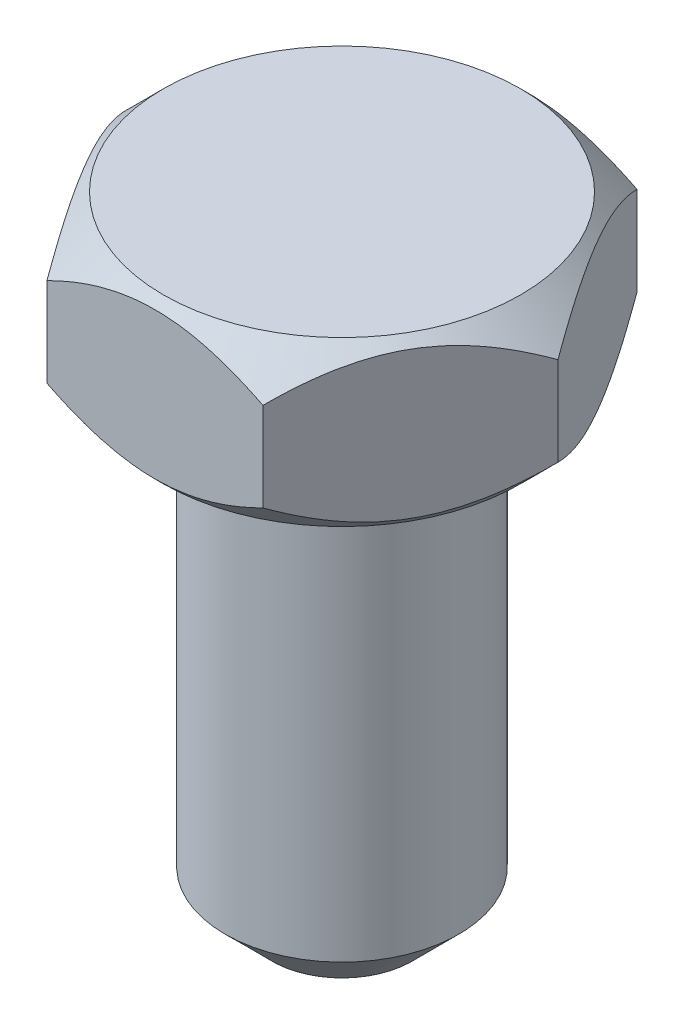
ISO-10303-21;
HEADER;
FILE_DESCRIPTION(('STEP AP214'),'2;1');
FILE_NAME('part.step','',(''),(''),'','','');
FILE_SCHEMA(('AUTOMOTIVE_DESIGN { 1 0 10303 214 1 1 1 1 }'));
ENDSEC;
DATA;
#1=APPLICATION_CONTEXT('core data for automotive mechanical design processes');
#2=APPLICATION_PROTOCOL_DEFINITION('international standard','automotive_design',2000,#1);
#3=PRODUCT_CONTEXT('',#1,'mechanical');
#4=PRODUCT('Part','Part','',(#3));
#5=PRODUCT_RELATED_PRODUCT_CATEGORY('part','',(#4));
#6=PRODUCT_DEFINITION_FORMATION('','',#4);
#7=PRODUCT_DEFINITION_CONTEXT('part definition',#1,'design');
#8=PRODUCT_DEFINITION('design','',#6,#7);
#9=PRODUCT_DEFINITION_SHAPE('','',#8);
#10=(LENGTH_UNIT() NAMED_UNIT(*) SI_UNIT(.MILLI.,.METRE.));
#11=(NAMED_UNIT(*) PLANE_ANGLE_UNIT() SI_UNIT($,.RADIAN.));
#12=(NAMED_UNIT(*) SI_UNIT($,.STERADIAN.) SOLID_ANGLE_UNIT());
#13=UNCERTAINTY_MEASURE_WITH_UNIT(LENGTH_MEASURE(1.E-05),#10,'distance_accuracy_value','');
#14=(GEOMETRIC_REPRESENTATION_CONTEXT(3) GLOBAL_UNCERTAINTY_ASSIGNED_CONTEXT((#13)) GLOBAL_UNIT_ASSIGNED_CONTEXT((#10,
#11,#12)) REPRESENTATION_CONTEXT('',''));
#15=CARTESIAN_POINT('',(0.,0.,0.));
#16=DIRECTION('',(0.,0.,1.));
#17=DIRECTION('',(1.,0.,0.));
#18=AXIS2_PLACEMENT_3D('',#15,#16,#17);
#19=CARTESIAN_POINT('',(-4.61880215351701,-3.5,0.));
#20=DIRECTION('',(0.,1.,0.));
#21=DIRECTION('',(0.,0.,1.));
#22=AXIS2_PLACEMENT_3D('',#19,#20,#21);
#23=PLANE('',#22);
#24=CARTESIAN_POINT('',(0.,-3.5,0.));
#25=DIRECTION('',(0.,1.,0.));
#26=DIRECTION('',(0.,0.,1.));
#27=AXIS2_PLACEMENT_3D('',#24,#25,#26);
#28=CIRCLE('',#27,3.81880215351701);
#29=CARTESIAN_POINT('',(0.,-3.5,3.81880215351701));
#30=VERTEX_POINT('',#29);
#31=EDGE_CURVE('E101',#30,#30,#28,.T.);
#32=ORIENTED_EDGE('',*,*,#31,.F.);
#33=EDGE_LOOP('',(#32));
#34=FACE_BOUND('',#33,.T.);
#35=CARTESIAN_POINT('',(0.,-3.5,0.));
#36=DIRECTION('',(0.,1.,0.));
#37=DIRECTION('',(0.,0.,1.));
#38=AXIS2_PLACEMENT_3D('',#35,#36,#37);
#39=CIRCLE('',#38,2.5);
#40=CARTESIAN_POINT('',(0.,-3.5,2.5));
#41=VERTEX_POINT('',#40);
#42=EDGE_CURVE('E116',#41,#41,#39,.F.);
#43=ORIENTED_EDGE('',*,*,#42,.F.);
#44=EDGE_LOOP('',(#43));
#45=FACE_BOUND('',#44,.T.);
#46=ADVANCED_FACE('F28',(#34,#45),#23,.F.);
#47=CARTESIAN_POINT('',(0.,-13.5,0.));
#48=DIRECTION('',(0.,1.,0.));
#49=DIRECTION('',(0.,0.,1.));
#50=AXIS2_PLACEMENT_3D('',#47,#48,#49);
#51=CYLINDRICAL_SURFACE('',#50,2.5);
#52=CARTESIAN_POINT('',(0.,-12.5,0.));
#53=DIRECTION('',(0.,-1.,0.));
#54=DIRECTION('',(0.,0.,-1.));
#55=AXIS2_PLACEMENT_3D('',#52,#53,#54);
#56=CIRCLE('',#55,2.5);
#57=CARTESIAN_POINT('',(0.,-12.5,-2.5));
#58=VERTEX_POINT('',#57);
#59=EDGE_CURVE('E41',#58,#58,#56,.F.);
#60=ORIENTED_EDGE('',*,*,#59,.T.);
#61=EDGE_LOOP('',(#60));
#62=FACE_BOUND('',#61,.T.);
#63=ORIENTED_EDGE('',*,*,#42,.T.);
#64=EDGE_LOOP('',(#63));
#65=FACE_BOUND('',#64,.T.);
#66=ADVANCED_FACE('F125',(#62,#65),#51,.T.);
#67=CARTESIAN_POINT('',(0.,-13.5,0.));
#68=DIRECTION('',(0.,-1.,0.));
#69=DIRECTION('',(0.,0.,-1.));
#70=AXIS2_PLACEMENT_3D('',#67,#68,#69);
#71=PLANE('',#70);
#72=CARTESIAN_POINT('',(0.,-13.5,0.));
#73=DIRECTION('',(0.,-1.,0.));
#74=DIRECTION('',(0.,0.,-1.));
#75=AXIS2_PLACEMENT_3D('',#72,#73,#74);
#76=CIRCLE('',#75,1.5);
#77=CARTESIAN_POINT('',(0.,-13.5,-1.5));
#78=VERTEX_POINT('',#77);
#79=EDGE_CURVE('E119',#78,#78,#76,.T.);
#80=ORIENTED_EDGE('',*,*,#79,.T.);
#81=EDGE_LOOP('',(#80));
#82=FACE_BOUND('',#81,.T.);
#83=ADVANCED_FACE('F131',(#82),#71,.T.);
#84=CARTESIAN_POINT('',(0.,-13.5,0.));
#85=DIRECTION('',(0.,1.,0.));
#86=DIRECTION('',(0.,0.,1.));
#87=AXIS2_PLACEMENT_3D('',#84,#85,#86);
#88=CONICAL_SURFACE('',#87,1.5,0.785398163397446);
#89=ORIENTED_EDGE('',*,*,#59,.F.);
#90=EDGE_LOOP('',(#89));
#91=FACE_BOUND('',#90,.T.);
#92=ORIENTED_EDGE('',*,*,#79,.F.);
#93=EDGE_LOOP('',(#92));
#94=FACE_BOUND('',#93,.T.);
#95=ADVANCED_FACE('F128',(#91,#94),#88,.T.);
#96=CARTESIAN_POINT('',(0.,-3.5,0.));
#97=DIRECTION('',(0.,1.,0.));
#98=DIRECTION('',(0.,0.,1.));
#99=AXIS2_PLACEMENT_3D('',#96,#97,#98);
#100=CONICAL_SURFACE('',#99,3.81880215351701,0.785398163397448);
#101=CARTESIAN_POINT('',(-4.61891762357085,-2.69988452561614,0.000200000000027756));
#102=CARTESIAN_POINT('',(-4.57920690352857,-2.73959114404244,-0.068580984718356));
#103=CARTESIAN_POINT('',(-4.53919230356692,-2.77807958288685,-0.137888304896475));
#104=CARTESIAN_POINT('',(-4.45849274714728,-2.8522487762645,-0.277664036763568));
#105=CARTESIAN_POINT('',(-4.41780743901014,-2.88792799726836,-0.348133057578679));
#106=CARTESIAN_POINT('',(-4.29427352009149,-2.99049913234901,-0.562100081603879));
#107=CARTESIAN_POINT('',(-4.21037499527408,-3.05248688898744,-0.707416589267722));
#108=CARTESIAN_POINT('',(-4.04121970302445,-3.1586441309906,-1.00040214981323));
#109=CARTESIAN_POINT('',(-3.95600566300933,-3.20308094454657,-1.14799719663762));
#110=CARTESIAN_POINT('',(-3.78369592639709,-3.27155101787056,-1.44644641508885));
#111=CARTESIAN_POINT('',(-3.6966055069617,-3.29563536213871,-1.59729144640342));
#112=CARTESIAN_POINT('',(-3.54650860589272,-3.31736511913948,-1.85726690511355));
#113=CARTESIAN_POINT('',(-3.48369550790706,-3.32058108535916,-1.96606238220551));
#114=CARTESIAN_POINT('',(-3.35817126167379,-3.31515994177501,-2.18347675426331));
#115=CARTESIAN_POINT('',(-3.29546015687919,-3.30651867682818,-2.29209557396634));
#116=CARTESIAN_POINT('',(-3.17063214810082,-3.27787596150358,-2.50830402737814));
#117=CARTESIAN_POINT('',(-3.10851598784037,-3.25786180544875,-2.61589237292032));
#118=CARTESIAN_POINT('',(-2.98535047827865,-3.20756584263536,-2.82922129322133));
#119=CARTESIAN_POINT('',(-2.92430104755975,-3.17728482312165,-2.93496200899963));
#120=CARTESIAN_POINT('',(-2.81592361944285,-3.11498474730579,-3.12267722089175));
#121=CARTESIAN_POINT('',(-2.76835567444983,-3.08460372013991,-3.2050673184313));
#122=CARTESIAN_POINT('',(-2.67407371522763,-3.01894553543967,-3.36836846204128));
#123=CARTESIAN_POINT('',(-2.6273597270248,-2.98366822896023,-3.44927946303275));
#124=CARTESIAN_POINT('',(-2.53493285809128,-2.90900831297909,-3.60936749601013));
#125=CARTESIAN_POINT('',(-2.48921734857499,-2.86963861299641,-3.68854908118623));
#126=CARTESIAN_POINT('',(-2.39863292742736,-2.78731089185671,-3.84544590098815));
#127=CARTESIAN_POINT('',(-2.35376351682289,-2.74435507219806,-3.92316199986076));
#128=CARTESIAN_POINT('',(-2.30928560670467,-2.69988452561615,-4.0002));
#129=B_SPLINE_CURVE_WITH_KNOTS('',3,(#101,#102,#103,#104,#105,#106,#107,#108,#109,#110,#111,
#112,#113,#114,#115,#116,#117,#118,#119,#120,#121,#122,#123,#124,#125,#126,#127,#128),
.UNSPECIFIED.,.F.,.F.,(4,2,2,2,2,2,2,2,2,2,2,2,2,4),(0.,0.266361961703665,0.532868334400115,
1.06875865685463,1.59613884594052,2.12219135055581,2.49866160599659,2.87526382203495,
3.25228760372077,3.62928248242858,3.92874944437162,4.22822551811347,4.52678401907576,
4.82516056577924),.UNSPECIFIED.);
#130=CARTESIAN_POINT('',(-4.61880215351702,-2.7,0.));
#131=VERTEX_POINT('',#130);
#132=CARTESIAN_POINT('',(-2.30940107675852,-2.7,-4.));
#133=VERTEX_POINT('',#132);
#134=EDGE_CURVE('E176',#131,#133,#129,.T.);
#135=ORIENTED_EDGE('',*,*,#134,.T.);
#136=CARTESIAN_POINT('',(-4.74669494328341,-1.11145868915222,-4.));
#137=CARTESIAN_POINT('',(-4.63173073558873,-1.1993508654303,-4.));
#138=CARTESIAN_POINT('',(-4.51613887537967,-1.28643511858206,-4.));
#139=CARTESIAN_POINT('',(-4.28344630120931,-1.45862113364621,-4.));
#140=CARTESIAN_POINT('',(-4.16634522978712,-1.54372241196675,-4.));
#141=CARTESIAN_POINT('',(-3.92952428886011,-1.71218153620796,-4.));
#142=CARTESIAN_POINT('',(-3.80979117395059,-1.79552082328341,-4.));
#143=CARTESIAN_POINT('',(-3.56831834415258,-1.95922999490112,-4.));
#144=CARTESIAN_POINT('',(-3.44657876940923,-2.03960008557233,-4.));
#145=CARTESIAN_POINT('',(-3.19323146896135,-2.20151222850148,-4.));
#146=CARTESIAN_POINT('',(-3.06147610302173,-2.28282442900108,-4.));
#147=CARTESIAN_POINT('',(-2.79487655444763,-2.44030225958758,-4.));
#148=CARTESIAN_POINT('',(-2.6600318671341,-2.51646704063563,-4.));
#149=CARTESIAN_POINT('',(-2.38723344772492,-2.66202065614541,-4.));
#150=CARTESIAN_POINT('',(-2.24929042181595,-2.73142939927244,-4.));
#151=CARTESIAN_POINT('',(-1.96955020070889,-2.86191616592764,-4.));
#152=CARTESIAN_POINT('',(-1.82775483658784,-2.92299806703933,-4.));
#153=CARTESIAN_POINT('',(-1.55337254847197,-3.02945404139103,-4.));
#154=CARTESIAN_POINT('',(-1.4211506740557,-3.07575938281105,-4.));
#155=CARTESIAN_POINT('',(-1.153400475509,-3.15777962167409,-4.));
#156=CARTESIAN_POINT('',(-1.01787193595579,-3.19349382712074,-4.));
#157=CARTESIAN_POINT('',(-0.746641513502644,-3.25182748471192,-4.));
#158=CARTESIAN_POINT('',(-0.610990636137922,-3.27468015045871,-4.));
#159=CARTESIAN_POINT('',(-0.338082766934168,-3.30682458453426,-4.));
#160=CARTESIAN_POINT('',(-0.200826093272512,-3.31611899495528,-4.));
#161=CARTESIAN_POINT('',(0.0682725110831627,-3.32038918600646,-4.));
#162=CARTESIAN_POINT('',(0.200105501326917,-3.31593690851227,-4.));
#163=CARTESIAN_POINT('',(0.462709681486531,-3.29425661019797,-4.));
#164=CARTESIAN_POINT('',(0.593480771402084,-3.27702739994749,-4.));
#165=CARTESIAN_POINT('',(0.855228740743153,-3.23046292068837,-4.));
#166=CARTESIAN_POINT('',(0.986167438767936,-3.20091656435704,-4.));
#167=CARTESIAN_POINT('',(1.24517252052895,-3.13133537173076,-4.));
#168=CARTESIAN_POINT('',(1.37323909358621,-3.09130122897531,-4.));
#169=CARTESIAN_POINT('',(1.6350146777751,-2.99940176499948,-4.));
#170=CARTESIAN_POINT('',(1.76850120421469,-2.94690960373252,-4.));
#171=CARTESIAN_POINT('',(2.03203083305245,-2.83383048639002,-4.));
#172=CARTESIAN_POINT('',(2.16207233412168,-2.77323984239489,-4.));
#173=CARTESIAN_POINT('',(2.41933252641898,-2.64540192173417,-4.));
#174=CARTESIAN_POINT('',(2.54654088208384,-2.57813401413965,-4.));
#175=CARTESIAN_POINT('',(2.79803896567839,-2.43842389721416,-4.));
#176=CARTESIAN_POINT('',(2.9223291435755,-2.36598249266423,-4.));
#177=CARTESIAN_POINT('',(3.16228713945874,-2.22062527401129,-4.));
#178=CARTESIAN_POINT('',(3.27807727928803,-2.14791032425798,-4.));
#179=CARTESIAN_POINT('',(3.5076685919422,-1.99939622591037,-4.));
#180=CARTESIAN_POINT('',(3.62146961421383,-1.92359684529293,-4.));
#181=CARTESIAN_POINT('',(3.84642549416774,-1.77008416558951,-4.));
#182=CARTESIAN_POINT('',(3.95759428564676,-1.69239121161213,-4.));
#183=CARTESIAN_POINT('',(4.17840845706007,-1.53493086471948,-4.));
#184=CARTESIAN_POINT('',(4.28805424827146,-1.4551640492307,-4.));
#185=CARTESIAN_POINT('',(4.39706149639085,-1.37454864251642,-4.));
#186=B_SPLINE_CURVE_WITH_KNOTS('',3,(#136,#137,#138,#139,#140,#141,#142,#143,#144,#145,#146,
#147,#148,#149,#150,#151,#152,#153,#154,#155,#156,#157,#158,#159,#160,#161,#162,#163,#164,#165,
#166,#167,#168,#169,#170,#171,#172,#173,#174,#175,#176,#177,#178,#179,#180,#181,#182,#183,#184,
#185),.UNSPECIFIED.,.F.,.F.,(4,2,2,2,2,2,2,2,2,2,2,2,2,2,2,2,2,2,2,2,2,2,2,2,4),(0.,
0.434146668569334,0.868398128074756,1.30600593465858,1.74358330412151,2.20796839055966,
2.672429888782,3.13547841811301,3.59831057635038,4.01823322720891,4.43818330864351,
4.85025065344053,5.26223768809276,5.65731799923051,6.05243509380702,6.45462166461373,
6.85678164621651,7.28676033389218,7.71693549838636,8.1484838030882,8.57996512242888,
8.9900948031474,9.4002553926905,9.80711077786197,10.2138540702172),.UNSPECIFIED.);
#187=CARTESIAN_POINT('',(2.3094010767585,-2.7,-4.00000000000002));
#188=VERTEX_POINT('',#187);
#189=EDGE_CURVE('E170',#133,#188,#186,.T.);
#190=ORIENTED_EDGE('',*,*,#189,.T.);
#191=CARTESIAN_POINT('',(2.30928560670467,-2.69988452561615,-4.0002));
#192=CARTESIAN_POINT('',(2.34899632674695,-2.73959114404245,-3.93141901528162));
#193=CARTESIAN_POINT('',(2.3890109267086,-2.77807958288686,-3.8621116951035));
#194=CARTESIAN_POINT('',(2.46971048312824,-2.8522487762645,-3.72233596323641));
#195=CARTESIAN_POINT('',(2.51039579126538,-2.88792799726837,-3.6518669424213));
#196=CARTESIAN_POINT('',(2.63392971018403,-2.99049913234902,-3.4378999183961));
#197=CARTESIAN_POINT('',(2.71782823500144,-3.05248688898745,-3.29258341073225));
#198=CARTESIAN_POINT('',(2.88698352725107,-3.15864413099061,-2.99959785018675));
#199=CARTESIAN_POINT('',(2.97219756726618,-3.20308094454657,-2.85200280336236));
#200=CARTESIAN_POINT('',(3.14450730387843,-3.27155101787056,-2.55355358491113));
#201=CARTESIAN_POINT('',(3.23159772331381,-3.29563536213871,-2.40270855359656));
#202=CARTESIAN_POINT('',(3.3816946243828,-3.31736511913948,-2.14273309488644));
#203=CARTESIAN_POINT('',(3.44450772236846,-3.32058108535916,-2.03393761779447));
#204=CARTESIAN_POINT('',(3.57003196860172,-3.31515994177501,-1.81652324573667));
#205=CARTESIAN_POINT('',(3.63274307339633,-3.30651867682818,-1.70790442603365));
#206=CARTESIAN_POINT('',(3.7575710821747,-3.27787596150358,-1.49169597262185));
#207=CARTESIAN_POINT('',(3.81968724243514,-3.25786180544875,-1.38410762707967));
#208=CARTESIAN_POINT('',(3.94285275199687,-3.20756584263536,-1.17077870677866));
#209=CARTESIAN_POINT('',(4.00390218271577,-3.17728482312165,-1.06503799100036));
#210=CARTESIAN_POINT('',(4.11227961083267,-3.11498474730579,-0.877322779108241));
#211=CARTESIAN_POINT('',(4.15984755582569,-3.08460372013991,-0.794932681568691));
#212=CARTESIAN_POINT('',(4.25412951504789,-3.01894553543967,-0.631631537958703));
#213=CARTESIAN_POINT('',(4.30084350325072,-2.98366822896023,-0.550720536967234));
#214=CARTESIAN_POINT('',(4.39327037218424,-2.90900831297908,-0.39063250398986));
#215=CARTESIAN_POINT('',(4.43898588170053,-2.86963861299641,-0.311450918813753));
#216=CARTESIAN_POINT('',(4.52957030284816,-2.78731089185671,-0.154554099011833));
#217=CARTESIAN_POINT('',(4.57443971345263,-2.74435507219805,-0.0768380001392213));
#218=CARTESIAN_POINT('',(4.61891762357085,-2.69988452561614,0.000200000000015641));
#219=B_SPLINE_CURVE_WITH_KNOTS('',3,(#191,#192,#193,#194,#195,#196,#197,#198,#199,#200,#201,
#202,#203,#204,#205,#206,#207,#208,#209,#210,#211,#212,#213,#214,#215,#216,#217,#218),
.UNSPECIFIED.,.F.,.F.,(4,2,2,2,2,2,2,2,2,2,2,2,2,4),(0.,0.266361961703664,0.532868334400111,
1.06875865685462,1.5961388459405,2.1221913505558,2.49866160599657,2.87526382203494,
3.25228760372076,3.62928248242857,3.92874944437161,4.22822551811345,4.52678401907575,
4.82516056577923),.UNSPECIFIED.);
#220=CARTESIAN_POINT('',(4.61880215351701,-2.7,0.));
#221=VERTEX_POINT('',#220);
#222=EDGE_CURVE('E89',#188,#221,#219,.T.);
#223=ORIENTED_EDGE('',*,*,#222,.T.);
#224=CARTESIAN_POINT('',(4.61891762357085,-2.69988452561614,-0.000199999999985046));
#225=CARTESIAN_POINT('',(4.57920690352856,-2.73959114404244,0.0685809847183984));
#226=CARTESIAN_POINT('',(4.53919230356692,-2.77807958288685,0.137888304896517));
#227=CARTESIAN_POINT('',(4.45849274714727,-2.8522487762645,0.277664036763609));
#228=CARTESIAN_POINT('',(4.41780743901014,-2.88792799726836,0.34813305757872));
#229=CARTESIAN_POINT('',(4.29427352009149,-2.99049913234901,0.562100081603918));
#230=CARTESIAN_POINT('',(4.21037499527407,-3.05248688898745,0.707416589267761));
#231=CARTESIAN_POINT('',(4.04121970302444,-3.15864413099061,1.00040214981327));
#232=CARTESIAN_POINT('',(3.95600566300932,-3.20308094454657,1.14799719663766));
#233=CARTESIAN_POINT('',(3.78369592639707,-3.27155101787056,1.44644641508888));
#234=CARTESIAN_POINT('',(3.69660550696169,-3.29563536213871,1.59729144640345));
#235=CARTESIAN_POINT('',(3.5465086058927,-3.31736511913948,1.85726690511358));
#236=CARTESIAN_POINT('',(3.48369550790704,-3.32058108535916,1.96606238220554));
#237=CARTESIAN_POINT('',(3.35817126167377,-3.31515994177501,2.18347675426334));
#238=CARTESIAN_POINT('',(3.29546015687917,-3.30651867682818,2.29209557396637));
#239=CARTESIAN_POINT('',(3.1706321481008,-3.27787596150358,2.50830402737817));
#240=CARTESIAN_POINT('',(3.10851598784035,-3.25786180544875,2.61589237292034));
#241=CARTESIAN_POINT('',(2.98535047827863,-3.20756584263536,2.82922129322135));
#242=CARTESIAN_POINT('',(2.92430104755973,-3.17728482312165,2.93496200899965));
#243=CARTESIAN_POINT('',(2.81592361944282,-3.11498474730579,3.12267722089177));
#244=CARTESIAN_POINT('',(2.76835567444981,-3.08460372013991,3.20506731843132));
#245=CARTESIAN_POINT('',(2.67407371522761,-3.01894553543968,3.3683684620413));
#246=CARTESIAN_POINT('',(2.62735972702478,-2.98366822896024,3.44927946303277));
#247=CARTESIAN_POINT('',(2.53493285809126,-2.90900831297909,3.60936749601014));
#248=CARTESIAN_POINT('',(2.48921734857497,-2.86963861299642,3.68854908118624));
#249=CARTESIAN_POINT('',(2.39863292742734,-2.78731089185672,3.84544590098816));
#250=CARTESIAN_POINT('',(2.35376351682287,-2.74435507219807,3.92316199986077));
#251=CARTESIAN_POINT('',(2.30928560670465,-2.69988452561616,4.0002));
#252=B_SPLINE_CURVE_WITH_KNOTS('',3,(#224,#225,#226,#227,#228,#229,#230,#231,#232,#233,#234,
#235,#236,#237,#238,#239,#240,#241,#242,#243,#244,#245,#246,#247,#248,#249,#250,#251),
.UNSPECIFIED.,.F.,.F.,(4,2,2,2,2,2,2,2,2,2,2,2,2,4),(0.,0.266361961703665,0.532868334400114,
1.06875865685463,1.59613884594051,2.12219135055581,2.49866160599659,2.87526382203495,
3.25228760372077,3.62928248242858,3.92874944437161,4.22822551811345,4.52678401907573,
4.82516056577921),.UNSPECIFIED.);
#253=CARTESIAN_POINT('',(2.30940107675852,-2.7,4.));
#254=VERTEX_POINT('',#253);
#255=EDGE_CURVE('E85',#221,#254,#252,.T.);
#256=ORIENTED_EDGE('',*,*,#255,.T.);
#257=CARTESIAN_POINT('',(-4.74669494331183,-1.11145868913049,4.));
#258=CARTESIAN_POINT('',(-4.63173073561633,-1.19935086540941,4.));
#259=CARTESIAN_POINT('',(-4.51613887540645,-1.28643511856201,4.));
#260=CARTESIAN_POINT('',(-4.28344630123446,-1.45862113362783,4.));
#261=CARTESIAN_POINT('',(-4.16634522981144,-1.5437224119492,4.));
#262=CARTESIAN_POINT('',(-3.92952428888276,-1.71218153619209,4.));
#263=CARTESIAN_POINT('',(-3.80979117397239,-1.79552082326838,4.));
#264=CARTESIAN_POINT('',(-3.56831834417267,-1.95922999488776,4.));
#265=CARTESIAN_POINT('',(-3.44657876942845,-2.03960008555979,4.));
#266=CARTESIAN_POINT('',(-3.1932314689787,-2.20151222849066,4.));
#267=CARTESIAN_POINT('',(-3.06147610303807,-2.28282442899116,4.));
#268=CARTESIAN_POINT('',(-2.79487655446192,-2.4403022595794,4.));
#269=CARTESIAN_POINT('',(-2.66003186714736,-2.51646704062831,4.));
#270=CARTESIAN_POINT('',(-2.38723344773605,-2.66202065613972,4.));
#271=CARTESIAN_POINT('',(-2.24929042182601,-2.73142939926754,4.));
#272=CARTESIAN_POINT('',(-1.96955020071673,-2.8619161659242,4.));
#273=CARTESIAN_POINT('',(-1.82775483659454,-2.92299806703658,4.));
#274=CARTESIAN_POINT('',(-1.55337254847819,-3.02945404138876,4.));
#275=CARTESIAN_POINT('',(-1.42115067406264,-3.07575938280871,4.));
#276=CARTESIAN_POINT('',(-1.15340047551737,-3.15777962167175,4.));
#277=CARTESIAN_POINT('',(-1.0178719359649,-3.19349382711846,4.));
#278=CARTESIAN_POINT('',(-0.7466415135132,-3.25182748470995,4.));
#279=CARTESIAN_POINT('',(-0.610990636149189,-3.27468015045698,4.));
#280=CARTESIAN_POINT('',(-0.338082766946836,-3.30682458453317,4.));
#281=CARTESIAN_POINT('',(-0.200826093285872,-3.31611899495459,4.));
#282=CARTESIAN_POINT('',(0.0682725110685937,-3.32038918600669,4.));
#283=CARTESIAN_POINT('',(0.200105501311828,-3.31593690851301,4.));
#284=CARTESIAN_POINT('',(0.462709681470457,-3.29425661019981,4.));
#285=CARTESIAN_POINT('',(0.593480771385546,-3.27702739994991,4.));
#286=CARTESIAN_POINT('',(0.855228740725698,-3.230462920692,4.));
#287=CARTESIAN_POINT('',(0.986167438750031,-3.20091656436132,4.));
#288=CARTESIAN_POINT('',(1.24517252051019,-3.13133537173633,4.));
#289=CARTESIAN_POINT('',(1.37323909356705,-3.09130122898153,4.));
#290=CARTESIAN_POINT('',(1.63501467775369,-2.99940176500754,4.));
#291=CARTESIAN_POINT('',(1.76850120419148,-2.94690960374188,4.));
#292=CARTESIAN_POINT('',(2.03203083302572,-2.8338304864021,4.));
#293=CARTESIAN_POINT('',(2.16207233409324,-2.77323984240839,4.));
#294=CARTESIAN_POINT('',(2.41933252638718,-2.6454019217506,4.));
#295=CARTESIAN_POINT('',(2.54654088205039,-2.5781340141576,4.));
#296=CARTESIAN_POINT('',(2.79803896564169,-2.43842389723518,4.));
#297=CARTESIAN_POINT('',(2.92232914353721,-2.3659824926868,4.));
#298=CARTESIAN_POINT('',(3.16228713941755,-2.22062527403683,4.));
#299=CARTESIAN_POINT('',(3.27807727924554,-2.14791032428491,4.));
#300=CARTESIAN_POINT('',(3.50766859189711,-1.99939622594009,4.));
#301=CARTESIAN_POINT('',(3.62146961416746,-1.92359684532405,4.));
#302=CARTESIAN_POINT('',(3.84642549411882,-1.77008416562341,4.));
#303=CARTESIAN_POINT('',(3.95759428559658,-1.69239121164742,4.));
#304=CARTESIAN_POINT('',(4.17840845700739,-1.53493086475754,4.));
#305=CARTESIAN_POINT('',(4.28805424821753,-1.45516404927014,4.));
#306=CARTESIAN_POINT('',(4.39706149633567,-1.37454864255723,4.));
#307=B_SPLINE_CURVE_WITH_KNOTS('',3,(#257,#258,#259,#260,#261,#262,#263,#264,#265,#266,#267,
#268,#269,#270,#271,#272,#273,#274,#275,#276,#277,#278,#279,#280,#281,#282,#283,#284,#285,#286,
#287,#288,#289,#290,#291,#292,#293,#294,#295,#296,#297,#298,#299,#300,#301,#302,#303,#304,#305,
#306),.UNSPECIFIED.,.F.,.F.,(4,2,2,2,2,2,2,2,2,2,2,2,2,2,2,2,2,2,2,2,2,2,2,2,4),(0.,
0.434146668572803,0.868398128081697,1.30600593466906,1.74358330413552,2.20796839057765,
2.67242988880396,3.13547841813892,3.59831057638022,4.01823322723668,4.43818330866922,
4.85025065346426,5.26223768811452,5.65731799925067,6.05243509382556,6.45462166463053,
6.85678164623158,7.2867603339008,7.71693549838852,8.14848380308387,8.57996512241806,
8.99009480313104,9.40025539266859,9.80711077783459,10.2138540701843),.UNSPECIFIED.);
#308=CARTESIAN_POINT('',(-2.30940107675848,-2.70000000000002,4.));
#309=VERTEX_POINT('',#308);
#310=EDGE_CURVE('E47',#254,#309,#307,.F.);
#311=ORIENTED_EDGE('',*,*,#310,.T.);
#312=CARTESIAN_POINT('',(-2.30928560670464,-2.69988452561616,4.0002));
#313=CARTESIAN_POINT('',(-2.34899632674693,-2.73959114404246,3.93141901528162));
#314=CARTESIAN_POINT('',(-2.38901092670858,-2.77807958288687,3.8621116951035));
#315=CARTESIAN_POINT('',(-2.46971048312822,-2.85224877626451,3.72233596323641));
#316=CARTESIAN_POINT('',(-2.51039579126535,-2.88792799726838,3.6518669424213));
#317=CARTESIAN_POINT('',(-2.633929710184,-2.99049913234903,3.43789991839611));
#318=CARTESIAN_POINT('',(-2.71782823500142,-3.05248688898745,3.29258341073227));
#319=CARTESIAN_POINT('',(-2.88698352725104,-3.15864413099061,2.99959785018676));
#320=CARTESIAN_POINT('',(-2.97219756726616,-3.20308094454658,2.85200280336238));
#321=CARTESIAN_POINT('',(-3.14450730387841,-3.27155101787057,2.55355358491116));
#322=CARTESIAN_POINT('',(-3.23159772331379,-3.29563536213871,2.40270855359659));
#323=CARTESIAN_POINT('',(-3.38169462438278,-3.31736511913948,2.14273309488647));
#324=CARTESIAN_POINT('',(-3.44450772236844,-3.32058108535916,2.0339376177945));
#325=CARTESIAN_POINT('',(-3.57003196860171,-3.31515994177501,1.81652324573671));
#326=CARTESIAN_POINT('',(-3.63274307339631,-3.30651867682818,1.70790442603368));
#327=CARTESIAN_POINT('',(-3.75757108217469,-3.27787596150358,1.49169597262188));
#328=CARTESIAN_POINT('',(-3.81968724243513,-3.25786180544875,1.3841076270797));
#329=CARTESIAN_POINT('',(-3.94285275199685,-3.20756584263536,1.1707787067787));
#330=CARTESIAN_POINT('',(-4.00390218271576,-3.17728482312165,1.0650379910004));
#331=CARTESIAN_POINT('',(-4.11227961083266,-3.11498474730579,0.877322779108279));
#332=CARTESIAN_POINT('',(-4.15984755582568,-3.08460372013991,0.794932681568729));
#333=CARTESIAN_POINT('',(-4.25412951504789,-3.01894553543967,0.631631537958742));
#334=CARTESIAN_POINT('',(-4.30084350325071,-2.98366822896023,0.550720536967273));
#335=CARTESIAN_POINT('',(-4.39327037218424,-2.90900831297908,0.3906325039899));
#336=CARTESIAN_POINT('',(-4.43898588170053,-2.86963861299641,0.311450918813793));
#337=CARTESIAN_POINT('',(-4.52957030284816,-2.78731089185671,0.154554099011874));
#338=CARTESIAN_POINT('',(-4.57443971345263,-2.74435507219805,0.0768380001392636));
#339=CARTESIAN_POINT('',(-4.61891762357085,-2.69988452561614,-0.000199999999972631));
#340=B_SPLINE_CURVE_WITH_KNOTS('',3,(#312,#313,#314,#315,#316,#317,#318,#319,#320,#321,#322,
#323,#324,#325,#326,#327,#328,#329,#330,#331,#332,#333,#334,#335,#336,#337,#338,#339),
.UNSPECIFIED.,.F.,.F.,(4,2,2,2,2,2,2,2,2,2,2,2,2,4),(0.,0.26636196170366,0.532868334400105,
1.06875865685461,1.59613884594049,2.12219135055577,2.49866160599655,2.87526382203491,
3.25228760372073,3.62928248242854,3.92874944437158,4.22822551811343,4.52678401907572,
4.82516056577921),.UNSPECIFIED.);
#341=EDGE_CURVE('E11',#309,#131,#340,.T.);
#342=ORIENTED_EDGE('',*,*,#341,.T.);
#343=EDGE_LOOP('',(#135,#190,#223,#256,#311,#342));
#344=FACE_BOUND('',#343,.T.);
#345=ORIENTED_EDGE('',*,*,#31,.T.);
#346=EDGE_LOOP('',(#345));
#347=FACE_BOUND('',#346,.T.);
#348=ADVANCED_FACE('F86',(#344,#347),#100,.T.);
#349=CARTESIAN_POINT('',(-4.61880215351701,0.,0.));
#350=DIRECTION('',(0.,1.,0.));
#351=DIRECTION('',(0.,0.,1.));
#352=AXIS2_PLACEMENT_3D('',#349,#350,#351);
#353=PLANE('',#352);
#354=CARTESIAN_POINT('',(0.,0.,0.));
#355=DIRECTION('',(0.,1.,0.));
#356=DIRECTION('',(0.,0.,1.));
#357=AXIS2_PLACEMENT_3D('',#354,#355,#356);
#358=CIRCLE('',#357,3.81880215351701);
#359=CARTESIAN_POINT('',(0.,0.,3.81880215351701));
#360=VERTEX_POINT('',#359);
#361=EDGE_CURVE('E233',#360,#360,#358,.T.);
#362=ORIENTED_EDGE('',*,*,#361,.T.);
#363=EDGE_LOOP('',(#362));
#364=FACE_BOUND('',#363,.T.);
#365=ADVANCED_FACE('F151',(#364),#353,.T.);
#366=CARTESIAN_POINT('',(0.,-0.8,0.));
#367=DIRECTION('',(0.,-1.,0.));
#368=DIRECTION('',(0.,0.,-1.));
#369=AXIS2_PLACEMENT_3D('',#366,#367,#368);
#370=CONICAL_SURFACE('',#369,4.61880215351701,0.785398163397448);
#371=CARTESIAN_POINT('',(-2.30928560670467,-0.80011547438385,-4.0002));
#372=CARTESIAN_POINT('',(-2.34899632674696,-0.76040885595755,-3.93141901528162));
#373=CARTESIAN_POINT('',(-2.3890109267086,-0.721920417113141,-3.8621116951035));
#374=CARTESIAN_POINT('',(-2.46971048312825,-0.647751223735498,-3.72233596323641));
#375=CARTESIAN_POINT('',(-2.51039579126538,-0.612072002731633,-3.65186694242129));
#376=CARTESIAN_POINT('',(-2.63392971018403,-0.509500867650983,-3.4378999183961));
#377=CARTESIAN_POINT('',(-2.71782823500145,-0.447513111012552,-3.29258341073225));
#378=CARTESIAN_POINT('',(-2.88698352725107,-0.341355869009392,-2.99959785018674));
#379=CARTESIAN_POINT('',(-2.97219756726619,-0.296919055453425,-2.85200280336235));
#380=CARTESIAN_POINT('',(-3.14450730387843,-0.228448982129436,-2.55355358491113));
#381=CARTESIAN_POINT('',(-3.23159772331382,-0.204364637861294,-2.40270855359656));
#382=CARTESIAN_POINT('',(-3.3816946243828,-0.182634880860519,-2.14273309488643));
#383=CARTESIAN_POINT('',(-3.44450772236846,-0.179418914640843,-2.03393761779447));
#384=CARTESIAN_POINT('',(-3.57003196860173,-0.184840058224988,-1.81652324573667));
#385=CARTESIAN_POINT('',(-3.63274307339633,-0.193481323171816,-1.70790442603364));
#386=CARTESIAN_POINT('',(-3.7575710821747,-0.222124038496419,-1.49169597262184));
#387=CARTESIAN_POINT('',(-3.81968724243515,-0.24213819455125,-1.38410762707966));
#388=CARTESIAN_POINT('',(-3.94285275199687,-0.292434157364639,-1.17077870677865));
#389=CARTESIAN_POINT('',(-4.00390218271577,-0.322715176878353,-1.06503799100035));
#390=CARTESIAN_POINT('',(-4.11227961083267,-0.385015252694212,-0.877322779108234));
#391=CARTESIAN_POINT('',(-4.15984755582569,-0.415396279860092,-0.794932681568683));
#392=CARTESIAN_POINT('',(-4.25412951504789,-0.481054464560328,-0.631631537958694));
#393=CARTESIAN_POINT('',(-4.30084350325072,-0.516331771039769,-0.550720536967224));
#394=CARTESIAN_POINT('',(-4.39327037218424,-0.590991687020916,-0.390632503989849));
#395=CARTESIAN_POINT('',(-4.43898588170053,-0.630361387003592,-0.311450918813742));
#396=CARTESIAN_POINT('',(-4.52957030284816,-0.712689108143292,-0.154554099011821));
#397=CARTESIAN_POINT('',(-4.57443971345263,-0.75564492780195,-0.0768380001392092));
#398=CARTESIAN_POINT('',(-4.61891762357085,-0.800115474383857,0.00020000000002798));
#399=B_SPLINE_CURVE_WITH_KNOTS('',3,(#371,#372,#373,#374,#375,#376,#377,#378,#379,#380,#381,
#382,#383,#384,#385,#386,#387,#388,#389,#390,#391,#392,#393,#394,#395,#396,#397,#398),
.UNSPECIFIED.,.F.,.F.,(4,2,2,2,2,2,2,2,2,2,2,2,2,4),(0.,0.266361961703663,0.532868334400112,
1.06875865685462,1.59613884594051,2.1221913505558,2.49866160599658,2.87526382203494,
3.25228760372076,3.62928248242857,3.92874944437161,4.22822551811346,4.52678401907576,
4.82516056577924),.UNSPECIFIED.);
#400=CARTESIAN_POINT('',(-2.30940107675852,-0.8,-4.));
#401=VERTEX_POINT('',#400);
#402=CARTESIAN_POINT('',(-4.61880215351701,-0.8,0.));
#403=VERTEX_POINT('',#402);
#404=EDGE_CURVE('E115',#401,#403,#399,.T.);
#405=ORIENTED_EDGE('',*,*,#404,.T.);
#406=CARTESIAN_POINT('',(-4.61891762357085,-0.800115474383857,-0.000199999999972244));
#407=CARTESIAN_POINT('',(-4.57920690352857,-0.760408855957556,0.0685809847184112));
#408=CARTESIAN_POINT('',(-4.53919230356692,-0.721920417113147,0.137888304896529));
#409=CARTESIAN_POINT('',(-4.45849274714727,-0.647751223735503,0.277664036763622));
#410=CARTESIAN_POINT('',(-4.41780743901014,-0.612072002731638,0.348133057578733));
#411=CARTESIAN_POINT('',(-4.29427352009148,-0.509500867650987,0.562100081603931));
#412=CARTESIAN_POINT('',(-4.21037499527407,-0.447513111012555,0.707416589267774));
#413=CARTESIAN_POINT('',(-4.04121970302444,-0.341355869009395,1.00040214981328));
#414=CARTESIAN_POINT('',(-3.95600566300932,-0.296919055453428,1.14799719663767));
#415=CARTESIAN_POINT('',(-3.78369592639707,-0.228448982129437,1.4464464150889));
#416=CARTESIAN_POINT('',(-3.69660550696168,-0.204364637861293,1.59729144640347));
#417=CARTESIAN_POINT('',(-3.54650860589269,-0.182634880860519,1.85726690511359));
#418=CARTESIAN_POINT('',(-3.48369550790703,-0.179418914640844,1.96606238220556));
#419=CARTESIAN_POINT('',(-3.35817126167376,-0.184840058224989,2.18347675426336));
#420=CARTESIAN_POINT('',(-3.29546015687916,-0.193481323171817,2.29209557396638));
#421=CARTESIAN_POINT('',(-3.17063214810078,-0.222124038496419,2.50830402737818));
#422=CARTESIAN_POINT('',(-3.10851598784034,-0.242138194551251,2.61589237292036));
#423=CARTESIAN_POINT('',(-2.98535047827862,-0.29243415736464,2.82922129322137));
#424=CARTESIAN_POINT('',(-2.92430104755971,-0.322715176878354,2.93496200899967));
#425=CARTESIAN_POINT('',(-2.81592361944281,-0.385015252694212,3.12267722089178));
#426=CARTESIAN_POINT('',(-2.76835567444979,-0.415396279860091,3.20506731843133));
#427=CARTESIAN_POINT('',(-2.67407371522759,-0.481054464560324,3.36836846204131));
#428=CARTESIAN_POINT('',(-2.62735972702477,-0.516331771039763,3.44927946303277));
#429=CARTESIAN_POINT('',(-2.53493285809125,-0.590991687020907,3.60936749601014));
#430=CARTESIAN_POINT('',(-2.48921734857496,-0.630361387003581,3.68854908118625));
#431=CARTESIAN_POINT('',(-2.39863292742733,-0.712689108143276,3.84544590098816));
#432=CARTESIAN_POINT('',(-2.35376351682286,-0.755644927801931,3.92316199986077));
#433=CARTESIAN_POINT('',(-2.30928560670464,-0.800115474383836,4.0002));
#434=B_SPLINE_CURVE_WITH_KNOTS('',3,(#406,#407,#408,#409,#410,#411,#412,#413,#414,#415,#416,
#417,#418,#419,#420,#421,#422,#423,#424,#425,#426,#427,#428,#429,#430,#431,#432,#433),
.UNSPECIFIED.,.F.,.F.,(4,2,2,2,2,2,2,2,2,2,2,2,2,4),(0.,0.266361961703666,0.532868334400115,
1.06875865685463,1.59613884594052,2.12219135055582,2.49866160599659,2.87526382203496,
3.25228760372078,3.62928248242859,3.92874944437162,4.22822551811345,4.52678401907573,
4.82516056577921),.UNSPECIFIED.);
#435=CARTESIAN_POINT('',(-2.30940107675846,-0.8,4.00000000000004));
#436=VERTEX_POINT('',#435);
#437=EDGE_CURVE('E236',#403,#436,#434,.T.);
#438=ORIENTED_EDGE('',*,*,#437,.T.);
#439=CARTESIAN_POINT('',(-4.74669494331183,-2.38854131086951,4.));
#440=CARTESIAN_POINT('',(-4.63173073561633,-2.30064913459059,4.));
#441=CARTESIAN_POINT('',(-4.51613887540645,-2.21356488143799,4.));
#442=CARTESIAN_POINT('',(-4.28344630123446,-2.04137886637217,4.));
#443=CARTESIAN_POINT('',(-4.16634522981144,-1.9562775880508,4.));
#444=CARTESIAN_POINT('',(-3.92952428888276,-1.78781846380791,4.));
#445=CARTESIAN_POINT('',(-3.80979117397239,-1.70447917673162,4.));
#446=CARTESIAN_POINT('',(-3.56831834417267,-1.54077000511224,4.));
#447=CARTESIAN_POINT('',(-3.44657876942845,-1.4603999144402,4.));
#448=CARTESIAN_POINT('',(-3.1932314689787,-1.29848777150934,4.));
#449=CARTESIAN_POINT('',(-3.06147610303807,-1.21717557100884,4.));
#450=CARTESIAN_POINT('',(-2.79487655446192,-1.0596977404206,4.));
#451=CARTESIAN_POINT('',(-2.66003186714736,-0.983532959371693,4.));
#452=CARTESIAN_POINT('',(-2.38723344773605,-0.83797934386028,4.));
#453=CARTESIAN_POINT('',(-2.24929042182601,-0.768570600732463,4.));
#454=CARTESIAN_POINT('',(-1.96955020071673,-0.638083834075798,4.));
#455=CARTESIAN_POINT('',(-1.82775483659454,-0.577001932963423,4.));
#456=CARTESIAN_POINT('',(-1.55337254847819,-0.470545958611243,4.));
#457=CARTESIAN_POINT('',(-1.42115067406264,-0.424240617191292,4.));
#458=CARTESIAN_POINT('',(-1.15340047551737,-0.342220378328252,4.));
#459=CARTESIAN_POINT('',(-1.0178719359649,-0.306506172881536,4.));
#460=CARTESIAN_POINT('',(-0.7466415135132,-0.248172515290046,4.));
#461=CARTESIAN_POINT('',(-0.610990636149189,-0.225319849543021,4.));
#462=CARTESIAN_POINT('',(-0.338082766946836,-0.193175415466834,4.));
#463=CARTESIAN_POINT('',(-0.200826093285872,-0.18388100504541,4.));
#464=CARTESIAN_POINT('',(0.0682725110685938,-0.179610813993308,4.));
#465=CARTESIAN_POINT('',(0.200105501311828,-0.184063091486993,4.));
#466=CARTESIAN_POINT('',(0.462709681470458,-0.205743389800194,4.));
#467=CARTESIAN_POINT('',(0.593480771385547,-0.222972600050089,4.));
#468=CARTESIAN_POINT('',(0.855228740725699,-0.269537079307995,4.));
#469=CARTESIAN_POINT('',(0.986167438750031,-0.299083435638683,4.));
#470=CARTESIAN_POINT('',(1.24517252051019,-0.368664628263667,4.));
#471=CARTESIAN_POINT('',(1.37323909356705,-0.40869877101847,4.));
#472=CARTESIAN_POINT('',(1.63501467775369,-0.500598234992463,4.));
#473=CARTESIAN_POINT('',(1.76850120419148,-0.553090396258124,4.));
#474=CARTESIAN_POINT('',(2.03203083302572,-0.666169513597902,4.));
#475=CARTESIAN_POINT('',(2.16207233409324,-0.72676015759161,4.));
#476=CARTESIAN_POINT('',(2.41933252638718,-0.854598078249394,4.));
#477=CARTESIAN_POINT('',(2.54654088205039,-0.921865985842403,4.));
#478=CARTESIAN_POINT('',(2.79803896564169,-1.06157610276482,4.));
#479=CARTESIAN_POINT('',(2.92232914353721,-1.1340175073132,4.));
#480=CARTESIAN_POINT('',(3.16228713941755,-1.27937472596317,4.));
#481=CARTESIAN_POINT('',(3.27807727924553,-1.35208967571509,4.));
#482=CARTESIAN_POINT('',(3.50766859189711,-1.5006037740599,4.));
#483=CARTESIAN_POINT('',(3.62146961416745,-1.57640315467594,4.));
#484=CARTESIAN_POINT('',(3.84642549411882,-1.72991583437659,4.));
#485=CARTESIAN_POINT('',(3.95759428559658,-1.80760878835258,4.));
#486=CARTESIAN_POINT('',(4.17840845700739,-1.96506913524246,4.));
#487=CARTESIAN_POINT('',(4.28805424821752,-2.04483595072986,4.));
#488=CARTESIAN_POINT('',(4.39706149633567,-2.12545135744276,4.));
#489=B_SPLINE_CURVE_WITH_KNOTS('',3,(#439,#440,#441,#442,#443,#444,#445,#446,#447,#448,#449,
#450,#451,#452,#453,#454,#455,#456,#457,#458,#459,#460,#461,#462,#463,#464,#465,#466,#467,#468,
#469,#470,#471,#472,#473,#474,#475,#476,#477,#478,#479,#480,#481,#482,#483,#484,#485,#486,#487,
#488),.UNSPECIFIED.,.F.,.F.,(4,2,2,2,2,2,2,2,2,2,2,2,2,2,2,2,2,2,2,2,2,2,2,2,4),(0.,
0.434146668572803,0.868398128081697,1.30600593466906,1.74358330413553,2.20796839057765,
2.67242988880397,3.13547841813892,3.59831057638022,4.01823322723668,4.43818330866922,
4.85025065346426,5.26223768811452,5.65731799925067,6.05243509382556,6.45462166463053,
6.85678164623157,7.2867603339008,7.71693549838852,8.14848380308387,8.57996512241806,
8.99009480313104,9.40025539266859,9.80711077783459,10.2138540701843),.UNSPECIFIED.);
#490=CARTESIAN_POINT('',(2.30940107675852,-0.8,4.));
#491=VERTEX_POINT('',#490);
#492=EDGE_CURVE('E210',#436,#491,#489,.T.);
#493=ORIENTED_EDGE('',*,*,#492,.T.);
#494=CARTESIAN_POINT('',(2.30928560670465,-0.80011547438384,4.0002));
#495=CARTESIAN_POINT('',(2.34899632674694,-0.760408855957541,3.93141901528162));
#496=CARTESIAN_POINT('',(2.38901092670859,-0.721920417113134,3.8621116951035));
#497=CARTESIAN_POINT('',(2.46971048312823,-0.647751223735491,3.72233596323641));
#498=CARTESIAN_POINT('',(2.51039579126536,-0.612072002731627,3.6518669424213));
#499=CARTESIAN_POINT('',(2.63392971018401,-0.509500867650978,3.4378999183961));
#500=CARTESIAN_POINT('',(2.71782823500143,-0.447513111012549,3.29258341073226));
#501=CARTESIAN_POINT('',(2.88698352725105,-0.341355869009391,2.99959785018676));
#502=CARTESIAN_POINT('',(2.97219756726617,-0.296919055453424,2.85200280336237));
#503=CARTESIAN_POINT('',(3.14450730387842,-0.228448982129436,2.55355358491115));
#504=CARTESIAN_POINT('',(3.2315977233138,-0.204364637861294,2.40270855359658));
#505=CARTESIAN_POINT('',(3.38169462438279,-0.18263488086052,2.14273309488646));
#506=CARTESIAN_POINT('',(3.44450772236845,-0.179418914640844,2.03393761779449));
#507=CARTESIAN_POINT('',(3.57003196860172,-0.18484005822499,1.81652324573669));
#508=CARTESIAN_POINT('',(3.63274307339632,-0.193481323171818,1.70790442603367));
#509=CARTESIAN_POINT('',(3.7575710821747,-0.22212403849642,1.49169597262187));
#510=CARTESIAN_POINT('',(3.81968724243514,-0.242138194551252,1.38410762707969));
#511=CARTESIAN_POINT('',(3.94285275199686,-0.292434157364641,1.17077870677868));
#512=CARTESIAN_POINT('',(4.00390218271576,-0.322715176878355,1.06503799100038));
#513=CARTESIAN_POINT('',(4.11227961083267,-0.385015252694214,0.877322779108265));
#514=CARTESIAN_POINT('',(4.15984755582569,-0.415396279860094,0.794932681568716));
#515=CARTESIAN_POINT('',(4.25412951504789,-0.48105446456033,0.631631537958729));
#516=CARTESIAN_POINT('',(4.30084350325072,-0.51633177103977,0.55072053696726));
#517=CARTESIAN_POINT('',(4.39327037218424,-0.590991687020917,0.390632503989887));
#518=CARTESIAN_POINT('',(4.43898588170053,-0.630361387003592,0.311450918813781));
#519=CARTESIAN_POINT('',(4.52957030284816,-0.712689108143291,0.154554099011862));
#520=CARTESIAN_POINT('',(4.57443971345263,-0.755644927801949,0.0768380001392509));
#521=CARTESIAN_POINT('',(4.61891762357085,-0.800115474383855,-0.000199999999985036));
#522=B_SPLINE_CURVE_WITH_KNOTS('',3,(#494,#495,#496,#497,#498,#499,#500,#501,#502,#503,#504,
#505,#506,#507,#508,#509,#510,#511,#512,#513,#514,#515,#516,#517,#518,#519,#520,#521),
.UNSPECIFIED.,.F.,.F.,(4,2,2,2,2,2,2,2,2,2,2,2,2,4),(0.,0.266361961703662,0.532868334400107,
1.06875865685461,1.59613884594049,2.12219135055578,2.49866160599656,2.87526382203492,
3.25228760372074,3.62928248242855,3.92874944437159,4.22822551811343,4.52678401907573,
4.82516056577921),.UNSPECIFIED.);
#523=CARTESIAN_POINT('',(4.61880215351701,-0.8,0.));
#524=VERTEX_POINT('',#523);
#525=EDGE_CURVE('E106',#491,#524,#522,.T.);
#526=ORIENTED_EDGE('',*,*,#525,.T.);
#527=CARTESIAN_POINT('',(4.61891762357085,-0.800115474383856,0.000200000000015093));
#528=CARTESIAN_POINT('',(4.57920690352857,-0.760408855957555,-0.0685809847183687));
#529=CARTESIAN_POINT('',(4.53919230356692,-0.721920417113146,-0.137888304896487));
#530=CARTESIAN_POINT('',(4.45849274714727,-0.647751223735502,-0.27766403676358));
#531=CARTESIAN_POINT('',(4.41780743901014,-0.612072002731637,-0.348133057578692));
#532=CARTESIAN_POINT('',(4.29427352009149,-0.509500867650986,-0.562100081603891));
#533=CARTESIAN_POINT('',(4.21037499527407,-0.447513111012554,-0.707416589267734));
#534=CARTESIAN_POINT('',(4.04121970302445,-0.341355869009394,-1.00040214981325));
#535=CARTESIAN_POINT('',(3.95600566300933,-0.296919055453427,-1.14799719663764));
#536=CARTESIAN_POINT('',(3.78369592639708,-0.228448982129437,-1.44644641508886));
#537=CARTESIAN_POINT('',(3.6966055069617,-0.204364637861294,-1.59729144640343));
#538=CARTESIAN_POINT('',(3.54650860589271,-0.182634880860519,-1.85726690511355));
#539=CARTESIAN_POINT('',(3.48369550790705,-0.179418914640843,-1.96606238220552));
#540=CARTESIAN_POINT('',(3.35817126167379,-0.184840058224988,-2.18347675426332));
#541=CARTESIAN_POINT('',(3.29546015687918,-0.193481323171817,-2.29209557396635));
#542=CARTESIAN_POINT('',(3.17063214810081,-0.22212403849642,-2.50830402737815));
#543=CARTESIAN_POINT('',(3.10851598784037,-0.242138194551251,-2.61589237292033));
#544=CARTESIAN_POINT('',(2.98535047827865,-0.29243415736464,-2.82922129322134));
#545=CARTESIAN_POINT('',(2.92430104755974,-0.322715176878354,-2.93496200899964));
#546=CARTESIAN_POINT('',(2.81592361944284,-0.385015252694213,-3.12267722089175));
#547=CARTESIAN_POINT('',(2.76835567444982,-0.415396279860092,-3.2050673184313));
#548=CARTESIAN_POINT('',(2.67407371522762,-0.481054464560327,-3.36836846204129));
#549=CARTESIAN_POINT('',(2.6273597270248,-0.516331771039767,-3.44927946303276));
#550=CARTESIAN_POINT('',(2.53493285809127,-0.590991687020913,-3.60936749601013));
#551=CARTESIAN_POINT('',(2.48921734857499,-0.630361387003588,-3.68854908118624));
#552=CARTESIAN_POINT('',(2.39863292742735,-0.712689108143285,-3.84544590098815));
#553=CARTESIAN_POINT('',(2.35376351682288,-0.755644927801942,-3.92316199986076));
#554=CARTESIAN_POINT('',(2.30928560670467,-0.800115474383848,-4.0002));
#555=B_SPLINE_CURVE_WITH_KNOTS('',3,(#527,#528,#529,#530,#531,#532,#533,#534,#535,#536,#537,
#538,#539,#540,#541,#542,#543,#544,#545,#546,#547,#548,#549,#550,#551,#552,#553,#554),
.UNSPECIFIED.,.F.,.F.,(4,2,2,2,2,2,2,2,2,2,2,2,2,4),(0.,0.266361961703666,0.532868334400115,
1.06875865685463,1.59613884594052,2.12219135055581,2.49866160599659,2.87526382203495,
3.25228760372077,3.62928248242858,3.92874944437162,4.22822551811346,4.52678401907575,
4.82516056577923),.UNSPECIFIED.);
#556=CARTESIAN_POINT('',(2.3094010767585,-0.8,-4.00000000000002));
#557=VERTEX_POINT('',#556);
#558=EDGE_CURVE('E209',#524,#557,#555,.T.);
#559=ORIENTED_EDGE('',*,*,#558,.T.);
#560=CARTESIAN_POINT('',(-4.74669494328341,-2.38854131084778,-4.));
#561=CARTESIAN_POINT('',(-4.63173073558873,-2.3006491345697,-4.));
#562=CARTESIAN_POINT('',(-4.51613887537967,-2.21356488141794,-4.));
#563=CARTESIAN_POINT('',(-4.28344630120931,-2.04137886635379,-4.));
#564=CARTESIAN_POINT('',(-4.16634522978711,-1.95627758803325,-4.));
#565=CARTESIAN_POINT('',(-3.92952428886011,-1.78781846379204,-4.));
#566=CARTESIAN_POINT('',(-3.80979117395059,-1.70447917671659,-4.));
#567=CARTESIAN_POINT('',(-3.56831834415258,-1.54077000509887,-4.));
#568=CARTESIAN_POINT('',(-3.44657876940923,-1.46039991442767,-4.));
#569=CARTESIAN_POINT('',(-3.19323146896135,-1.29848777149852,-4.));
#570=CARTESIAN_POINT('',(-3.06147610302173,-1.21717557099892,-4.));
#571=CARTESIAN_POINT('',(-2.79487655444763,-1.05969774041242,-4.));
#572=CARTESIAN_POINT('',(-2.6600318671341,-0.983532959364369,-4.));
#573=CARTESIAN_POINT('',(-2.38723344772492,-0.83797934385459,-4.));
#574=CARTESIAN_POINT('',(-2.24929042181595,-0.768570600727555,-4.));
#575=CARTESIAN_POINT('',(-1.96955020070889,-0.638083834072357,-4.));
#576=CARTESIAN_POINT('',(-1.82775483658784,-0.577001932960666,-4.));
#577=CARTESIAN_POINT('',(-1.55337254847197,-0.470545958608969,-4.));
#578=CARTESIAN_POINT('',(-1.4211506740557,-0.424240617188946,-4.));
#579=CARTESIAN_POINT('',(-1.153400475509,-0.342220378325906,-4.));
#580=CARTESIAN_POINT('',(-1.01787193595579,-0.306506172879262,-4.));
#581=CARTESIAN_POINT('',(-0.746641513502643,-0.248172515288083,-4.));
#582=CARTESIAN_POINT('',(-0.610990636137921,-0.225319849541293,-4.));
#583=CARTESIAN_POINT('',(-0.338082766934167,-0.19317541546574,-4.));
#584=CARTESIAN_POINT('',(-0.200826093272511,-0.183881005044716,-4.));
#585=CARTESIAN_POINT('',(0.0682725110831636,-0.179610813993538,-4.));
#586=CARTESIAN_POINT('',(0.200105501326918,-0.184063091487732,-4.));
#587=CARTESIAN_POINT('',(0.462709681486532,-0.205743389802027,-4.));
#588=CARTESIAN_POINT('',(0.593480771402085,-0.222972600052506,-4.));
#589=CARTESIAN_POINT('',(0.855228740743153,-0.269537079311635,-4.));
#590=CARTESIAN_POINT('',(0.986167438767936,-0.299083435642963,-4.));
#591=CARTESIAN_POINT('',(1.24517252052895,-0.368664628269238,-4.));
#592=CARTESIAN_POINT('',(1.37323909358621,-0.40869877102469,-4.));
#593=CARTESIAN_POINT('',(1.6350146777751,-0.500598235000524,-4.));
#594=CARTESIAN_POINT('',(1.76850120421469,-0.55309039626748,-4.));
#595=CARTESIAN_POINT('',(2.03203083305245,-0.666169513609978,-4.));
#596=CARTESIAN_POINT('',(2.16207233412168,-0.726760157605111,-4.));
#597=CARTESIAN_POINT('',(2.41933252641899,-0.854598078265832,-4.));
#598=CARTESIAN_POINT('',(2.54654088208384,-0.921865985860352,-4.));
#599=CARTESIAN_POINT('',(2.79803896567839,-1.06157610278584,-4.));
#600=CARTESIAN_POINT('',(2.9223291435755,-1.13401750733577,-4.));
#601=CARTESIAN_POINT('',(3.16228713945874,-1.27937472598871,-4.));
#602=CARTESIAN_POINT('',(3.27807727928803,-1.35208967574202,-4.));
#603=CARTESIAN_POINT('',(3.5076685919422,-1.50060377408963,-4.));
#604=CARTESIAN_POINT('',(3.62146961421384,-1.57640315470707,-4.));
#605=CARTESIAN_POINT('',(3.84642549416775,-1.7299158344105,-4.));
#606=CARTESIAN_POINT('',(3.95759428564676,-1.80760878838788,-4.));
#607=CARTESIAN_POINT('',(4.17840845706008,-1.96506913528052,-4.));
#608=CARTESIAN_POINT('',(4.28805424827146,-2.04483595076931,-4.));
#609=CARTESIAN_POINT('',(4.39706149639086,-2.12545135748359,-4.));
#610=B_SPLINE_CURVE_WITH_KNOTS('',3,(#560,#561,#562,#563,#564,#565,#566,#567,#568,#569,#570,
#571,#572,#573,#574,#575,#576,#577,#578,#579,#580,#581,#582,#583,#584,#585,#586,#587,#588,#589,
#590,#591,#592,#593,#594,#595,#596,#597,#598,#599,#600,#601,#602,#603,#604,#605,#606,#607,#608,
#609),.UNSPECIFIED.,.F.,.F.,(4,2,2,2,2,2,2,2,2,2,2,2,2,2,2,2,2,2,2,2,2,2,2,2,4),(0.,
0.434146668569332,0.868398128074757,1.30600593465858,1.74358330412151,2.20796839055966,
2.672429888782,3.13547841811301,3.59831057635038,4.01823322720892,4.43818330864351,
4.85025065344053,5.26223768809276,5.65731799923052,6.05243509380702,6.45462166461373,
6.85678164621651,7.28676033389218,7.71693549838636,8.1484838030882,8.57996512242889,
8.99009480314741,9.40025539269051,9.80711077786198,10.2138540702172),.UNSPECIFIED.);
#611=EDGE_CURVE('E162',#557,#401,#610,.F.);
#612=ORIENTED_EDGE('',*,*,#611,.T.);
#613=EDGE_LOOP('',(#405,#438,#493,#526,#559,#612));
#614=FACE_BOUND('',#613,.T.);
#615=ORIENTED_EDGE('',*,*,#361,.F.);
#616=EDGE_LOOP('',(#615));
#617=FACE_BOUND('',#616,.T.);
#618=ADVANCED_FACE('F185',(#614,#617),#370,.T.);
#619=CARTESIAN_POINT('',(-2.30940107675848,-3.5,4.));
#620=DIRECTION('',(-0.866025403784434,0.,0.500000000000008));
#621=DIRECTION('',(0.500000000000008,0.,0.866025403784434));
#622=AXIS2_PLACEMENT_3D('',#619,#620,#621);
#623=PLANE('',#622);
#624=ORIENTED_EDGE('',*,*,#341,.F.);
#625=DIRECTION('',(0.,1.,0.));
#626=VECTOR('',#625,1.);
#627=CARTESIAN_POINT('',(-2.30940107675848,-3.5,4.));
#628=LINE('',#627,#626);
#629=EDGE_CURVE('E100',#309,#436,#628,.T.);
#630=ORIENTED_EDGE('',*,*,#629,.T.);
#631=ORIENTED_EDGE('',*,*,#437,.F.);
#632=DIRECTION('',(0.,1.,0.));
#633=VECTOR('',#632,1.);
#634=CARTESIAN_POINT('',(-4.61880215351701,-3.5,0.));
#635=LINE('',#634,#633);
#636=EDGE_CURVE('E55',#131,#403,#635,.T.);
#637=ORIENTED_EDGE('',*,*,#636,.F.);
#638=EDGE_LOOP('',(#624,#630,#631,#637));
#639=FACE_BOUND('',#638,.T.);
#640=ADVANCED_FACE('F235',(#639),#623,.T.);
#641=CARTESIAN_POINT('',(2.30940107675849,-3.5,4.));
#642=DIRECTION('',(0.,0.,1.));
#643=DIRECTION('',(1.,0.,0.));
#644=AXIS2_PLACEMENT_3D('',#641,#642,#643);
#645=PLANE('',#644);
#646=ORIENTED_EDGE('',*,*,#310,.F.);
#647=DIRECTION('',(0.,1.,0.));
#648=VECTOR('',#647,1.);
#649=CARTESIAN_POINT('',(2.30940107675849,-3.5,4.));
#650=LINE('',#649,#648);
#651=EDGE_CURVE('E98',#254,#491,#650,.T.);
#652=ORIENTED_EDGE('',*,*,#651,.T.);
#653=ORIENTED_EDGE('',*,*,#492,.F.);
#654=ORIENTED_EDGE('',*,*,#629,.F.);
#655=EDGE_LOOP('',(#646,#652,#653,#654));
#656=FACE_BOUND('',#655,.T.);
#657=ADVANCED_FACE('F96',(#656),#645,.T.);
#658=CARTESIAN_POINT('',(4.61880215351701,-3.5,0.));
#659=DIRECTION('',(0.866025403784436,0.,0.500000000000005));
#660=DIRECTION('',(0.500000000000005,0.,-0.866025403784436));
#661=AXIS2_PLACEMENT_3D('',#658,#659,#660);
#662=PLANE('',#661);
#663=ORIENTED_EDGE('',*,*,#255,.F.);
#664=DIRECTION('',(0.,1.,0.));
#665=VECTOR('',#664,1.);
#666=CARTESIAN_POINT('',(4.61880215351701,-3.5,0.));
#667=LINE('',#666,#665);
#668=EDGE_CURVE('E107',#221,#524,#667,.T.);
#669=ORIENTED_EDGE('',*,*,#668,.T.);
#670=ORIENTED_EDGE('',*,*,#525,.F.);
#671=ORIENTED_EDGE('',*,*,#651,.F.);
#672=EDGE_LOOP('',(#663,#669,#670,#671));
#673=FACE_BOUND('',#672,.T.);
#674=ADVANCED_FACE('F104',(#673),#662,.T.);
#675=CARTESIAN_POINT('',(2.3094010767585,-3.5,-4.));
#676=DIRECTION('',(0.866025403784439,0.,-0.5));
#677=DIRECTION('',(-0.5,0.,-0.866025403784439));
#678=AXIS2_PLACEMENT_3D('',#675,#676,#677);
#679=PLANE('',#678);
#680=ORIENTED_EDGE('',*,*,#222,.F.);
#681=DIRECTION('',(0.,1.,0.));
#682=VECTOR('',#681,1.);
#683=CARTESIAN_POINT('',(2.3094010767585,-3.5,-4.));
#684=LINE('',#683,#682);
#685=EDGE_CURVE('E109',#188,#557,#684,.T.);
#686=ORIENTED_EDGE('',*,*,#685,.T.);
#687=ORIENTED_EDGE('',*,*,#558,.F.);
#688=ORIENTED_EDGE('',*,*,#668,.F.);
#689=EDGE_LOOP('',(#680,#686,#687,#688));
#690=FACE_BOUND('',#689,.T.);
#691=ADVANCED_FACE('F156',(#690),#679,.T.);
#692=CARTESIAN_POINT('',(-2.30940107675851,-3.5,-4.));
#693=DIRECTION('',(0.,0.,-1.));
#694=DIRECTION('',(-1.,0.,0.));
#695=AXIS2_PLACEMENT_3D('',#692,#693,#694);
#696=PLANE('',#695);
#697=ORIENTED_EDGE('',*,*,#189,.F.);
#698=DIRECTION('',(0.,1.,0.));
#699=VECTOR('',#698,1.);
#700=CARTESIAN_POINT('',(-2.30940107675851,-3.5,-4.));
#701=LINE('',#700,#699);
#702=EDGE_CURVE('E120',#133,#401,#701,.T.);
#703=ORIENTED_EDGE('',*,*,#702,.T.);
#704=ORIENTED_EDGE('',*,*,#611,.F.);
#705=ORIENTED_EDGE('',*,*,#685,.F.);
#706=EDGE_LOOP('',(#697,#703,#704,#705));
#707=FACE_BOUND('',#706,.T.);
#708=ADVANCED_FACE('F152',(#707),#696,.T.);
#709=CARTESIAN_POINT('',(-4.61880215351701,-3.5,0.));
#710=DIRECTION('',(-0.86602540378444,0.,-0.499999999999998));
#711=DIRECTION('',(-0.499999999999998,0.,0.86602540378444));
#712=AXIS2_PLACEMENT_3D('',#709,#710,#711);
#713=PLANE('',#712);
#714=ORIENTED_EDGE('',*,*,#134,.F.);
#715=ORIENTED_EDGE('',*,*,#636,.T.);
#716=ORIENTED_EDGE('',*,*,#404,.F.);
#717=ORIENTED_EDGE('',*,*,#702,.F.);
#718=EDGE_LOOP('',(#714,#715,#716,#717));
#719=FACE_BOUND('',#718,.T.);
#720=ADVANCED_FACE('F30',(#719),#713,.T.);
#721=CLOSED_SHELL('',(#46,#66,#83,#95,#348,#365,#618,#640,#657,#674,#691,#708,#720));
#722=MANIFOLD_SOLID_BREP('B2',#721);
#723=ADVANCED_BREP_SHAPE_REPRESENTATION('',(#18,#722),#14);
#724=SHAPE_DEFINITION_REPRESENTATION(#9,#723);
ENDSEC;
END-ISO-10303-21;
